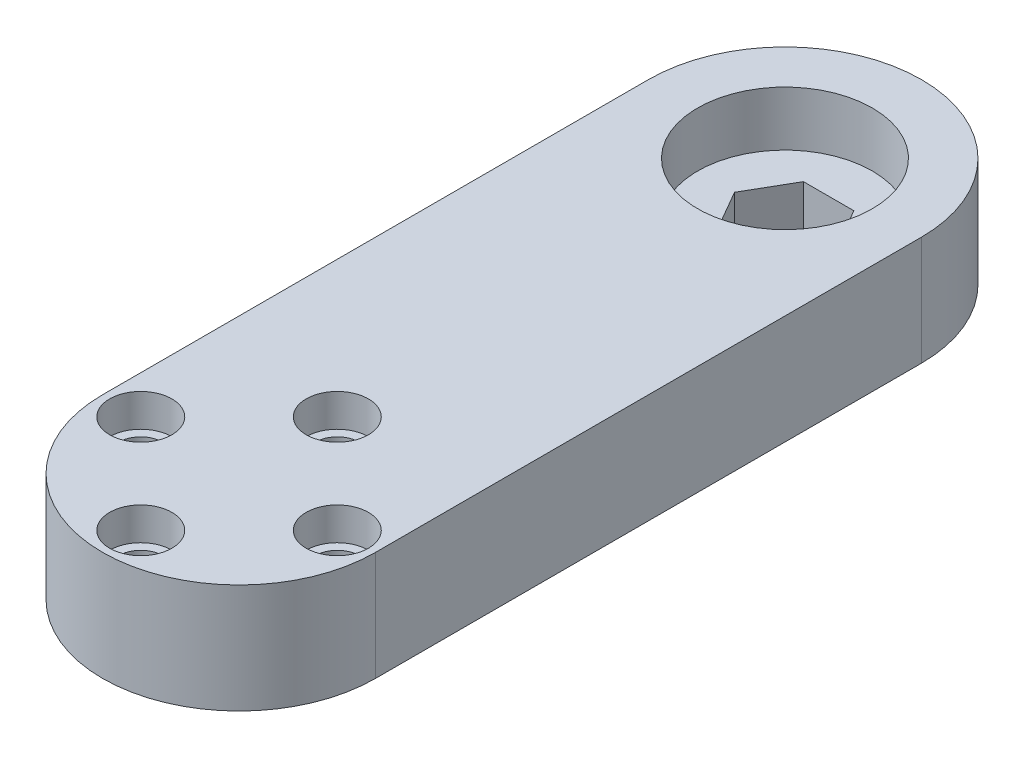
ISO-10303-21;
HEADER;
FILE_DESCRIPTION(('STEP AP214'),'2;1');
FILE_NAME('part.step','',(''),(''),'','','');
FILE_SCHEMA(('AUTOMOTIVE_DESIGN { 1 0 10303 214 1 1 1 1 }'));
ENDSEC;
DATA;
#1=APPLICATION_CONTEXT('core data for automotive mechanical design processes');
#2=APPLICATION_PROTOCOL_DEFINITION('international standard','automotive_design',2000,#1);
#3=PRODUCT_CONTEXT('',#1,'mechanical');
#4=PRODUCT('Part','Part','',(#3));
#5=PRODUCT_RELATED_PRODUCT_CATEGORY('part','',(#4));
#6=PRODUCT_DEFINITION_FORMATION('','',#4);
#7=PRODUCT_DEFINITION_CONTEXT('part definition',#1,'design');
#8=PRODUCT_DEFINITION('design','',#6,#7);
#9=PRODUCT_DEFINITION_SHAPE('','',#8);
#10=(LENGTH_UNIT() NAMED_UNIT(*) SI_UNIT(.MILLI.,.METRE.));
#11=(NAMED_UNIT(*) PLANE_ANGLE_UNIT() SI_UNIT($,.RADIAN.));
#12=(NAMED_UNIT(*) SI_UNIT($,.STERADIAN.) SOLID_ANGLE_UNIT());
#13=UNCERTAINTY_MEASURE_WITH_UNIT(LENGTH_MEASURE(1.E-05),#10,'distance_accuracy_value','');
#14=(GEOMETRIC_REPRESENTATION_CONTEXT(3) GLOBAL_UNCERTAINTY_ASSIGNED_CONTEXT((#13)) GLOBAL_UNIT_ASSIGNED_CONTEXT((#10,
#11,#12)) REPRESENTATION_CONTEXT('',''));
#15=CARTESIAN_POINT('',(0.,0.,0.));
#16=DIRECTION('',(0.,0.,1.));
#17=DIRECTION('',(1.,0.,0.));
#18=AXIS2_PLACEMENT_3D('',#15,#16,#17);
#19=CARTESIAN_POINT('',(0.,10.,0.));
#20=DIRECTION('',(0.,-1.,0.));
#21=DIRECTION('',(0.,0.,-1.));
#22=AXIS2_PLACEMENT_3D('',#19,#20,#21);
#23=CYLINDRICAL_SURFACE('',#22,12.5);
#24=CARTESIAN_POINT('',(0.,0.,0.));
#25=DIRECTION('',(0.,1.,0.));
#26=DIRECTION('',(0.,0.,1.));
#27=AXIS2_PLACEMENT_3D('',#24,#25,#26);
#28=CIRCLE('',#27,12.5);
#29=CARTESIAN_POINT('',(-12.5,0.,0.));
#30=VERTEX_POINT('',#29);
#31=CARTESIAN_POINT('',(12.5,0.,0.));
#32=VERTEX_POINT('',#31);
#33=EDGE_CURVE('E171',#30,#32,#28,.T.);
#34=ORIENTED_EDGE('',*,*,#33,.T.);
#35=DIRECTION('',(0.,-1.,0.));
#36=VECTOR('',#35,1.);
#37=CARTESIAN_POINT('',(12.5,10.,0.));
#38=LINE('',#37,#36);
#39=CARTESIAN_POINT('',(12.5,10.,0.));
#40=VERTEX_POINT('',#39);
#41=EDGE_CURVE('E220',#40,#32,#38,.T.);
#42=ORIENTED_EDGE('',*,*,#41,.F.);
#43=CARTESIAN_POINT('',(0.,10.,0.));
#44=DIRECTION('',(0.,1.,0.));
#45=DIRECTION('',(0.,0.,1.));
#46=AXIS2_PLACEMENT_3D('',#43,#44,#45);
#47=CIRCLE('',#46,12.5);
#48=CARTESIAN_POINT('',(-12.5,10.,0.));
#49=VERTEX_POINT('',#48);
#50=EDGE_CURVE('E194',#49,#40,#47,.T.);
#51=ORIENTED_EDGE('',*,*,#50,.F.);
#52=DIRECTION('',(0.,-1.,0.));
#53=VECTOR('',#52,1.);
#54=CARTESIAN_POINT('',(-12.5,10.,0.));
#55=LINE('',#54,#53);
#56=EDGE_CURVE('E204',#49,#30,#55,.T.);
#57=ORIENTED_EDGE('',*,*,#56,.T.);
#58=EDGE_LOOP('',(#34,#42,#51,#57));
#59=FACE_BOUND('',#58,.T.);
#60=ADVANCED_FACE('F34',(#59),#23,.T.);
#61=CARTESIAN_POINT('',(12.5,10.,0.));
#62=DIRECTION('',(-1.,0.,0.));
#63=DIRECTION('',(0.,0.,1.));
#64=AXIS2_PLACEMENT_3D('',#61,#62,#63);
#65=PLANE('',#64);
#66=DIRECTION('',(0.,0.,-1.));
#67=VECTOR('',#66,1.);
#68=CARTESIAN_POINT('',(12.5,0.,0.));
#69=LINE('',#68,#67);
#70=CARTESIAN_POINT('',(12.5,0.,-50.));
#71=VERTEX_POINT('',#70);
#72=EDGE_CURVE('E207',#32,#71,#69,.T.);
#73=ORIENTED_EDGE('',*,*,#72,.T.);
#74=DIRECTION('',(0.,-1.,0.));
#75=VECTOR('',#74,1.);
#76=CARTESIAN_POINT('',(12.5,10.,-50.));
#77=LINE('',#76,#75);
#78=CARTESIAN_POINT('',(12.5,10.,-50.));
#79=VERTEX_POINT('',#78);
#80=EDGE_CURVE('E217',#79,#71,#77,.T.);
#81=ORIENTED_EDGE('',*,*,#80,.F.);
#82=DIRECTION('',(0.,0.,-1.));
#83=VECTOR('',#82,1.);
#84=CARTESIAN_POINT('',(12.5,10.,0.));
#85=LINE('',#84,#83);
#86=EDGE_CURVE('E197',#40,#79,#85,.T.);
#87=ORIENTED_EDGE('',*,*,#86,.F.);
#88=ORIENTED_EDGE('',*,*,#41,.T.);
#89=EDGE_LOOP('',(#73,#81,#87,#88));
#90=FACE_BOUND('',#89,.T.);
#91=ADVANCED_FACE('F267',(#90),#65,.F.);
#92=CARTESIAN_POINT('',(0.,10.,-50.));
#93=DIRECTION('',(0.,-1.,0.));
#94=DIRECTION('',(0.,0.,-1.));
#95=AXIS2_PLACEMENT_3D('',#92,#93,#94);
#96=CYLINDRICAL_SURFACE('',#95,12.5);
#97=CARTESIAN_POINT('',(0.,0.,-50.));
#98=DIRECTION('',(0.,1.,0.));
#99=DIRECTION('',(0.,0.,1.));
#100=AXIS2_PLACEMENT_3D('',#97,#98,#99);
#101=CIRCLE('',#100,12.5);
#102=CARTESIAN_POINT('',(-12.5,0.,-50.));
#103=VERTEX_POINT('',#102);
#104=EDGE_CURVE('E209',#71,#103,#101,.T.);
#105=ORIENTED_EDGE('',*,*,#104,.T.);
#106=DIRECTION('',(0.,-1.,0.));
#107=VECTOR('',#106,1.);
#108=CARTESIAN_POINT('',(-12.5,10.,-50.));
#109=LINE('',#108,#107);
#110=CARTESIAN_POINT('',(-12.5,10.,-50.));
#111=VERTEX_POINT('',#110);
#112=EDGE_CURVE('E214',#111,#103,#109,.T.);
#113=ORIENTED_EDGE('',*,*,#112,.F.);
#114=CARTESIAN_POINT('',(0.,10.,-50.));
#115=DIRECTION('',(0.,1.,0.));
#116=DIRECTION('',(0.,0.,1.));
#117=AXIS2_PLACEMENT_3D('',#114,#115,#116);
#118=CIRCLE('',#117,12.5);
#119=EDGE_CURVE('E200',#79,#111,#118,.T.);
#120=ORIENTED_EDGE('',*,*,#119,.F.);
#121=ORIENTED_EDGE('',*,*,#80,.T.);
#122=EDGE_LOOP('',(#105,#113,#120,#121));
#123=FACE_BOUND('',#122,.T.);
#124=ADVANCED_FACE('F272',(#123),#96,.T.);
#125=CARTESIAN_POINT('',(-12.5,10.,0.));
#126=DIRECTION('',(1.,0.,0.));
#127=DIRECTION('',(0.,0.,-1.));
#128=AXIS2_PLACEMENT_3D('',#125,#126,#127);
#129=PLANE('',#128);
#130=DIRECTION('',(0.,0.,1.));
#131=VECTOR('',#130,1.);
#132=CARTESIAN_POINT('',(-12.5,0.,0.));
#133=LINE('',#132,#131);
#134=EDGE_CURVE('E198',#103,#30,#133,.T.);
#135=ORIENTED_EDGE('',*,*,#134,.T.);
#136=ORIENTED_EDGE('',*,*,#56,.F.);
#137=DIRECTION('',(0.,0.,1.));
#138=VECTOR('',#137,1.);
#139=CARTESIAN_POINT('',(-12.5,10.,0.));
#140=LINE('',#139,#138);
#141=EDGE_CURVE('E202',#111,#49,#140,.T.);
#142=ORIENTED_EDGE('',*,*,#141,.F.);
#143=ORIENTED_EDGE('',*,*,#112,.T.);
#144=EDGE_LOOP('',(#135,#136,#142,#143));
#145=FACE_BOUND('',#144,.T.);
#146=ADVANCED_FACE('F288',(#145),#129,.F.);
#147=CARTESIAN_POINT('',(0.,10.,0.));
#148=DIRECTION('',(0.,1.,0.));
#149=DIRECTION('',(0.,0.,1.));
#150=AXIS2_PLACEMENT_3D('',#147,#148,#149);
#151=PLANE('',#150);
#152=CARTESIAN_POINT('',(0.,10.,-50.));
#153=DIRECTION('',(0.,-1.,0.));
#154=DIRECTION('',(0.,0.,-1.));
#155=AXIS2_PLACEMENT_3D('',#152,#153,#154);
#156=CIRCLE('',#155,8.);
#157=CARTESIAN_POINT('',(0.,10.,-58.));
#158=VERTEX_POINT('',#157);
#159=EDGE_CURVE('E143',#158,#158,#156,.T.);
#160=ORIENTED_EDGE('',*,*,#159,.T.);
#161=EDGE_LOOP('',(#160));
#162=FACE_BOUND('',#161,.T.);
#163=CARTESIAN_POINT('',(0.,10.,-9.));
#164=DIRECTION('',(0.,1.,0.));
#165=DIRECTION('',(0.,0.,1.));
#166=AXIS2_PLACEMENT_3D('',#163,#164,#165);
#167=CIRCLE('',#166,2.85);
#168=CARTESIAN_POINT('',(0.,10.,-6.15));
#169=VERTEX_POINT('',#168);
#170=EDGE_CURVE('E172',#169,#169,#167,.T.);
#171=ORIENTED_EDGE('',*,*,#170,.F.);
#172=EDGE_LOOP('',(#171));
#173=FACE_BOUND('',#172,.T.);
#174=CARTESIAN_POINT('',(9.,10.,0.));
#175=DIRECTION('',(0.,1.,0.));
#176=DIRECTION('',(0.,0.,1.));
#177=AXIS2_PLACEMENT_3D('',#174,#175,#176);
#178=CIRCLE('',#177,2.85);
#179=CARTESIAN_POINT('',(9.,10.,2.85));
#180=VERTEX_POINT('',#179);
#181=EDGE_CURVE('E178',#180,#180,#178,.T.);
#182=ORIENTED_EDGE('',*,*,#181,.F.);
#183=EDGE_LOOP('',(#182));
#184=FACE_BOUND('',#183,.T.);
#185=CARTESIAN_POINT('',(0.,10.,9.));
#186=DIRECTION('',(0.,1.,0.));
#187=DIRECTION('',(0.,0.,1.));
#188=AXIS2_PLACEMENT_3D('',#185,#186,#187);
#189=CIRCLE('',#188,2.85);
#190=CARTESIAN_POINT('',(0.,10.,11.85));
#191=VERTEX_POINT('',#190);
#192=EDGE_CURVE('E184',#191,#191,#189,.T.);
#193=ORIENTED_EDGE('',*,*,#192,.F.);
#194=EDGE_LOOP('',(#193));
#195=FACE_BOUND('',#194,.T.);
#196=CARTESIAN_POINT('',(-9.,10.,0.));
#197=DIRECTION('',(0.,1.,0.));
#198=DIRECTION('',(0.,0.,1.));
#199=AXIS2_PLACEMENT_3D('',#196,#197,#198);
#200=CIRCLE('',#199,2.85);
#201=CARTESIAN_POINT('',(-9.,10.,2.85));
#202=VERTEX_POINT('',#201);
#203=EDGE_CURVE('E190',#202,#202,#200,.T.);
#204=ORIENTED_EDGE('',*,*,#203,.F.);
#205=EDGE_LOOP('',(#204));
#206=FACE_BOUND('',#205,.T.);
#207=ORIENTED_EDGE('',*,*,#50,.T.);
#208=ORIENTED_EDGE('',*,*,#86,.T.);
#209=ORIENTED_EDGE('',*,*,#119,.T.);
#210=ORIENTED_EDGE('',*,*,#141,.T.);
#211=EDGE_LOOP('',(#207,#208,#209,#210));
#212=FACE_BOUND('',#211,.T.);
#213=ADVANCED_FACE('F284',(#162,#173,#184,#195,#206,#212),#151,.T.);
#214=CARTESIAN_POINT('',(0.,0.,0.));
#215=DIRECTION('',(0.,1.,0.));
#216=DIRECTION('',(0.,0.,1.));
#217=AXIS2_PLACEMENT_3D('',#214,#215,#216);
#218=PLANE('',#217);
#219=DIRECTION('',(-0.5,0.,0.866025403784438));
#220=VECTOR('',#219,1.);
#221=CARTESIAN_POINT('',(4.61880215351699,0.,-50.));
#222=LINE('',#221,#220);
#223=CARTESIAN_POINT('',(4.618802153517,0.,-50.));
#224=VERTEX_POINT('',#223);
#225=CARTESIAN_POINT('',(2.3094010767585,0.,-46.));
#226=VERTEX_POINT('',#225);
#227=EDGE_CURVE('E122',#224,#226,#222,.T.);
#228=ORIENTED_EDGE('',*,*,#227,.F.);
#229=DIRECTION('',(0.5,0.,0.866025403784439));
#230=VECTOR('',#229,1.);
#231=CARTESIAN_POINT('',(2.30940107675849,0.,-54.));
#232=LINE('',#231,#230);
#233=CARTESIAN_POINT('',(2.30940107675849,0.,-54.));
#234=VERTEX_POINT('',#233);
#235=EDGE_CURVE('E48',#234,#224,#232,.T.);
#236=ORIENTED_EDGE('',*,*,#235,.F.);
#237=DIRECTION('',(1.,0.,0.));
#238=VECTOR('',#237,1.);
#239=CARTESIAN_POINT('',(-2.3094010767585,0.,-54.));
#240=LINE('',#239,#238);
#241=CARTESIAN_POINT('',(-2.3094010767585,0.,-54.));
#242=VERTEX_POINT('',#241);
#243=EDGE_CURVE('E138',#242,#234,#240,.T.);
#244=ORIENTED_EDGE('',*,*,#243,.F.);
#245=DIRECTION('',(0.5,0.,-0.866025403784439));
#246=VECTOR('',#245,1.);
#247=CARTESIAN_POINT('',(-4.618802153517,0.,-50.));
#248=LINE('',#247,#246);
#249=CARTESIAN_POINT('',(-4.618802153517,0.,-50.));
#250=VERTEX_POINT('',#249);
#251=EDGE_CURVE('E132',#250,#242,#248,.T.);
#252=ORIENTED_EDGE('',*,*,#251,.F.);
#253=DIRECTION('',(-0.500000000000001,0.,-0.866025403784438));
#254=VECTOR('',#253,1.);
#255=CARTESIAN_POINT('',(-2.3094010767585,0.,-46.));
#256=LINE('',#255,#254);
#257=CARTESIAN_POINT('',(-2.3094010767585,0.,-46.));
#258=VERTEX_POINT('',#257);
#259=EDGE_CURVE('E130',#258,#250,#256,.T.);
#260=ORIENTED_EDGE('',*,*,#259,.F.);
#261=DIRECTION('',(-1.,0.,0.));
#262=VECTOR('',#261,1.);
#263=CARTESIAN_POINT('',(2.3094010767585,0.,-46.));
#264=LINE('',#263,#262);
#265=EDGE_CURVE('E113',#226,#258,#264,.T.);
#266=ORIENTED_EDGE('',*,*,#265,.F.);
#267=EDGE_LOOP('',(#228,#236,#244,#252,#260,#266));
#268=FACE_BOUND('',#267,.T.);
#269=CARTESIAN_POINT('',(0.,0.,-9.));
#270=DIRECTION('',(0.,1.,0.));
#271=DIRECTION('',(0.,0.,1.));
#272=AXIS2_PLACEMENT_3D('',#269,#270,#271);
#273=CIRCLE('',#272,2.);
#274=CARTESIAN_POINT('',(0.,0.,-7.));
#275=VERTEX_POINT('',#274);
#276=EDGE_CURVE('E156',#275,#275,#273,.T.);
#277=ORIENTED_EDGE('',*,*,#276,.T.);
#278=EDGE_LOOP('',(#277));
#279=FACE_BOUND('',#278,.T.);
#280=CARTESIAN_POINT('',(9.,0.,0.));
#281=DIRECTION('',(0.,1.,0.));
#282=DIRECTION('',(0.,0.,1.));
#283=AXIS2_PLACEMENT_3D('',#280,#281,#282);
#284=CIRCLE('',#283,2.);
#285=CARTESIAN_POINT('',(9.,0.,2.));
#286=VERTEX_POINT('',#285);
#287=EDGE_CURVE('E160',#286,#286,#284,.T.);
#288=ORIENTED_EDGE('',*,*,#287,.T.);
#289=EDGE_LOOP('',(#288));
#290=FACE_BOUND('',#289,.T.);
#291=CARTESIAN_POINT('',(0.,0.,9.));
#292=DIRECTION('',(0.,1.,0.));
#293=DIRECTION('',(0.,0.,1.));
#294=AXIS2_PLACEMENT_3D('',#291,#292,#293);
#295=CIRCLE('',#294,2.);
#296=CARTESIAN_POINT('',(0.,0.,11.));
#297=VERTEX_POINT('',#296);
#298=EDGE_CURVE('E163',#297,#297,#295,.T.);
#299=ORIENTED_EDGE('',*,*,#298,.T.);
#300=EDGE_LOOP('',(#299));
#301=FACE_BOUND('',#300,.T.);
#302=CARTESIAN_POINT('',(-9.,0.,0.));
#303=DIRECTION('',(0.,1.,0.));
#304=DIRECTION('',(0.,0.,1.));
#305=AXIS2_PLACEMENT_3D('',#302,#303,#304);
#306=CIRCLE('',#305,2.);
#307=CARTESIAN_POINT('',(-9.,0.,2.));
#308=VERTEX_POINT('',#307);
#309=EDGE_CURVE('E153',#308,#308,#306,.T.);
#310=ORIENTED_EDGE('',*,*,#309,.T.);
#311=EDGE_LOOP('',(#310));
#312=FACE_BOUND('',#311,.T.);
#313=ORIENTED_EDGE('',*,*,#33,.F.);
#314=ORIENTED_EDGE('',*,*,#134,.F.);
#315=ORIENTED_EDGE('',*,*,#104,.F.);
#316=ORIENTED_EDGE('',*,*,#72,.F.);
#317=EDGE_LOOP('',(#313,#314,#315,#316));
#318=FACE_BOUND('',#317,.T.);
#319=ADVANCED_FACE('F126',(#268,#279,#290,#301,#312,#318),#218,.F.);
#320=CARTESIAN_POINT('',(-9.,7.,0.));
#321=DIRECTION('',(0.,1.,0.));
#322=DIRECTION('',(0.,0.,1.));
#323=AXIS2_PLACEMENT_3D('',#320,#321,#322);
#324=CYLINDRICAL_SURFACE('',#323,2.85);
#325=CARTESIAN_POINT('',(-9.,7.,0.));
#326=DIRECTION('',(0.,1.,0.));
#327=DIRECTION('',(0.,0.,1.));
#328=AXIS2_PLACEMENT_3D('',#325,#326,#327);
#329=CIRCLE('',#328,2.85);
#330=CARTESIAN_POINT('',(-9.,7.,2.85));
#331=VERTEX_POINT('',#330);
#332=EDGE_CURVE('E187',#331,#331,#329,.T.);
#333=ORIENTED_EDGE('',*,*,#332,.F.);
#334=EDGE_LOOP('',(#333));
#335=FACE_BOUND('',#334,.T.);
#336=ORIENTED_EDGE('',*,*,#203,.T.);
#337=EDGE_LOOP('',(#336));
#338=FACE_BOUND('',#337,.T.);
#339=ADVANCED_FACE('F299',(#335,#338),#324,.F.);
#340=CARTESIAN_POINT('',(-9.,7.,0.));
#341=DIRECTION('',(0.,1.,0.));
#342=DIRECTION('',(0.,0.,1.));
#343=AXIS2_PLACEMENT_3D('',#340,#341,#342);
#344=PLANE('',#343);
#345=CARTESIAN_POINT('',(-9.,7.,0.));
#346=DIRECTION('',(0.,1.,0.));
#347=DIRECTION('',(0.,0.,1.));
#348=AXIS2_PLACEMENT_3D('',#345,#346,#347);
#349=CIRCLE('',#348,2.);
#350=CARTESIAN_POINT('',(-9.,7.,2.));
#351=VERTEX_POINT('',#350);
#352=EDGE_CURVE('E193',#351,#351,#349,.T.);
#353=ORIENTED_EDGE('',*,*,#352,.F.);
#354=EDGE_LOOP('',(#353));
#355=FACE_BOUND('',#354,.T.);
#356=ORIENTED_EDGE('',*,*,#332,.T.);
#357=EDGE_LOOP('',(#356));
#358=FACE_BOUND('',#357,.T.);
#359=ADVANCED_FACE('F305',(#355,#358),#344,.T.);
#360=CARTESIAN_POINT('',(0.,7.,9.));
#361=DIRECTION('',(0.,1.,0.));
#362=DIRECTION('',(0.,0.,1.));
#363=AXIS2_PLACEMENT_3D('',#360,#361,#362);
#364=CYLINDRICAL_SURFACE('',#363,2.85);
#365=CARTESIAN_POINT('',(0.,7.,9.));
#366=DIRECTION('',(0.,1.,0.));
#367=DIRECTION('',(0.,0.,1.));
#368=AXIS2_PLACEMENT_3D('',#365,#366,#367);
#369=CIRCLE('',#368,2.85);
#370=CARTESIAN_POINT('',(0.,7.,11.85));
#371=VERTEX_POINT('',#370);
#372=EDGE_CURVE('E181',#371,#371,#369,.T.);
#373=ORIENTED_EDGE('',*,*,#372,.F.);
#374=EDGE_LOOP('',(#373));
#375=FACE_BOUND('',#374,.T.);
#376=ORIENTED_EDGE('',*,*,#192,.T.);
#377=EDGE_LOOP('',(#376));
#378=FACE_BOUND('',#377,.T.);
#379=ADVANCED_FACE('F309',(#375,#378),#364,.F.);
#380=CARTESIAN_POINT('',(0.,7.,9.));
#381=DIRECTION('',(0.,1.,0.));
#382=DIRECTION('',(0.,0.,1.));
#383=AXIS2_PLACEMENT_3D('',#380,#381,#382);
#384=PLANE('',#383);
#385=CARTESIAN_POINT('',(0.,7.,9.));
#386=DIRECTION('',(0.,1.,0.));
#387=DIRECTION('',(0.,0.,1.));
#388=AXIS2_PLACEMENT_3D('',#385,#386,#387);
#389=CIRCLE('',#388,2.);
#390=CARTESIAN_POINT('',(0.,7.,11.));
#391=VERTEX_POINT('',#390);
#392=EDGE_CURVE('E229',#391,#391,#389,.T.);
#393=ORIENTED_EDGE('',*,*,#392,.F.);
#394=EDGE_LOOP('',(#393));
#395=FACE_BOUND('',#394,.T.);
#396=ORIENTED_EDGE('',*,*,#372,.T.);
#397=EDGE_LOOP('',(#396));
#398=FACE_BOUND('',#397,.T.);
#399=ADVANCED_FACE('F313',(#395,#398),#384,.T.);
#400=CARTESIAN_POINT('',(9.,7.,0.));
#401=DIRECTION('',(0.,1.,0.));
#402=DIRECTION('',(0.,0.,1.));
#403=AXIS2_PLACEMENT_3D('',#400,#401,#402);
#404=CYLINDRICAL_SURFACE('',#403,2.85);
#405=CARTESIAN_POINT('',(9.,7.,0.));
#406=DIRECTION('',(0.,1.,0.));
#407=DIRECTION('',(0.,0.,1.));
#408=AXIS2_PLACEMENT_3D('',#405,#406,#407);
#409=CIRCLE('',#408,2.85);
#410=CARTESIAN_POINT('',(9.,7.,2.85));
#411=VERTEX_POINT('',#410);
#412=EDGE_CURVE('E175',#411,#411,#409,.T.);
#413=ORIENTED_EDGE('',*,*,#412,.F.);
#414=EDGE_LOOP('',(#413));
#415=FACE_BOUND('',#414,.T.);
#416=ORIENTED_EDGE('',*,*,#181,.T.);
#417=EDGE_LOOP('',(#416));
#418=FACE_BOUND('',#417,.T.);
#419=ADVANCED_FACE('F317',(#415,#418),#404,.F.);
#420=CARTESIAN_POINT('',(9.,7.,0.));
#421=DIRECTION('',(0.,1.,0.));
#422=DIRECTION('',(0.,0.,1.));
#423=AXIS2_PLACEMENT_3D('',#420,#421,#422);
#424=PLANE('',#423);
#425=CARTESIAN_POINT('',(9.,7.,0.));
#426=DIRECTION('',(0.,1.,0.));
#427=DIRECTION('',(0.,0.,1.));
#428=AXIS2_PLACEMENT_3D('',#425,#426,#427);
#429=CIRCLE('',#428,2.);
#430=CARTESIAN_POINT('',(9.,7.,2.));
#431=VERTEX_POINT('',#430);
#432=EDGE_CURVE('E226',#431,#431,#429,.T.);
#433=ORIENTED_EDGE('',*,*,#432,.F.);
#434=EDGE_LOOP('',(#433));
#435=FACE_BOUND('',#434,.T.);
#436=ORIENTED_EDGE('',*,*,#412,.T.);
#437=EDGE_LOOP('',(#436));
#438=FACE_BOUND('',#437,.T.);
#439=ADVANCED_FACE('F321',(#435,#438),#424,.T.);
#440=CARTESIAN_POINT('',(0.,7.,-9.));
#441=DIRECTION('',(0.,1.,0.));
#442=DIRECTION('',(0.,0.,1.));
#443=AXIS2_PLACEMENT_3D('',#440,#441,#442);
#444=CYLINDRICAL_SURFACE('',#443,2.85);
#445=CARTESIAN_POINT('',(0.,7.,-9.));
#446=DIRECTION('',(0.,1.,0.));
#447=DIRECTION('',(0.,0.,1.));
#448=AXIS2_PLACEMENT_3D('',#445,#446,#447);
#449=CIRCLE('',#448,2.85);
#450=CARTESIAN_POINT('',(0.,7.,-6.15));
#451=VERTEX_POINT('',#450);
#452=EDGE_CURVE('E168',#451,#451,#449,.T.);
#453=ORIENTED_EDGE('',*,*,#452,.F.);
#454=EDGE_LOOP('',(#453));
#455=FACE_BOUND('',#454,.T.);
#456=ORIENTED_EDGE('',*,*,#170,.T.);
#457=EDGE_LOOP('',(#456));
#458=FACE_BOUND('',#457,.T.);
#459=ADVANCED_FACE('F325',(#455,#458),#444,.F.);
#460=CARTESIAN_POINT('',(0.,7.,-9.));
#461=DIRECTION('',(0.,1.,0.));
#462=DIRECTION('',(0.,0.,1.));
#463=AXIS2_PLACEMENT_3D('',#460,#461,#462);
#464=PLANE('',#463);
#465=CARTESIAN_POINT('',(0.,7.,-9.));
#466=DIRECTION('',(0.,1.,0.));
#467=DIRECTION('',(0.,0.,1.));
#468=AXIS2_PLACEMENT_3D('',#465,#466,#467);
#469=CIRCLE('',#468,2.);
#470=CARTESIAN_POINT('',(0.,7.,-7.));
#471=VERTEX_POINT('',#470);
#472=EDGE_CURVE('E159',#471,#471,#469,.T.);
#473=ORIENTED_EDGE('',*,*,#472,.F.);
#474=EDGE_LOOP('',(#473));
#475=FACE_BOUND('',#474,.T.);
#476=ORIENTED_EDGE('',*,*,#452,.T.);
#477=EDGE_LOOP('',(#476));
#478=FACE_BOUND('',#477,.T.);
#479=ADVANCED_FACE('F329',(#475,#478),#464,.T.);
#480=CARTESIAN_POINT('',(0.,0.,-9.));
#481=DIRECTION('',(0.,1.,0.));
#482=DIRECTION('',(0.,0.,1.));
#483=AXIS2_PLACEMENT_3D('',#480,#481,#482);
#484=CYLINDRICAL_SURFACE('',#483,2.);
#485=ORIENTED_EDGE('',*,*,#472,.T.);
#486=EDGE_LOOP('',(#485));
#487=FACE_BOUND('',#486,.T.);
#488=ORIENTED_EDGE('',*,*,#276,.F.);
#489=EDGE_LOOP('',(#488));
#490=FACE_BOUND('',#489,.T.);
#491=ADVANCED_FACE('F333',(#487,#490),#484,.F.);
#492=CARTESIAN_POINT('',(9.,0.,0.));
#493=DIRECTION('',(0.,1.,0.));
#494=DIRECTION('',(0.,0.,1.));
#495=AXIS2_PLACEMENT_3D('',#492,#493,#494);
#496=CYLINDRICAL_SURFACE('',#495,2.);
#497=ORIENTED_EDGE('',*,*,#432,.T.);
#498=EDGE_LOOP('',(#497));
#499=FACE_BOUND('',#498,.T.);
#500=ORIENTED_EDGE('',*,*,#287,.F.);
#501=EDGE_LOOP('',(#500));
#502=FACE_BOUND('',#501,.T.);
#503=ADVANCED_FACE('F342',(#499,#502),#496,.F.);
#504=CARTESIAN_POINT('',(0.,0.,9.));
#505=DIRECTION('',(0.,1.,0.));
#506=DIRECTION('',(0.,0.,1.));
#507=AXIS2_PLACEMENT_3D('',#504,#505,#506);
#508=CYLINDRICAL_SURFACE('',#507,2.);
#509=ORIENTED_EDGE('',*,*,#392,.T.);
#510=EDGE_LOOP('',(#509));
#511=FACE_BOUND('',#510,.T.);
#512=ORIENTED_EDGE('',*,*,#298,.F.);
#513=EDGE_LOOP('',(#512));
#514=FACE_BOUND('',#513,.T.);
#515=ADVANCED_FACE('F338',(#511,#514),#508,.F.);
#516=CARTESIAN_POINT('',(-9.,0.,0.));
#517=DIRECTION('',(0.,1.,0.));
#518=DIRECTION('',(0.,0.,1.));
#519=AXIS2_PLACEMENT_3D('',#516,#517,#518);
#520=CYLINDRICAL_SURFACE('',#519,2.);
#521=ORIENTED_EDGE('',*,*,#352,.T.);
#522=EDGE_LOOP('',(#521));
#523=FACE_BOUND('',#522,.T.);
#524=ORIENTED_EDGE('',*,*,#309,.F.);
#525=EDGE_LOOP('',(#524));
#526=FACE_BOUND('',#525,.T.);
#527=ADVANCED_FACE('F335',(#523,#526),#520,.F.);
#528=CARTESIAN_POINT('',(0.,5.,-50.));
#529=DIRECTION('',(0.,1.,0.));
#530=DIRECTION('',(0.,0.,1.));
#531=AXIS2_PLACEMENT_3D('',#528,#529,#530);
#532=CYLINDRICAL_SURFACE('',#531,8.);
#533=CARTESIAN_POINT('',(0.,5.,-50.));
#534=DIRECTION('',(0.,-1.,0.));
#535=DIRECTION('',(0.,0.,-1.));
#536=AXIS2_PLACEMENT_3D('',#533,#534,#535);
#537=CIRCLE('',#536,8.);
#538=CARTESIAN_POINT('',(0.,5.,-58.));
#539=VERTEX_POINT('',#538);
#540=EDGE_CURVE('E150',#539,#539,#537,.T.);
#541=ORIENTED_EDGE('',*,*,#540,.T.);
#542=EDGE_LOOP('',(#541));
#543=FACE_BOUND('',#542,.T.);
#544=ORIENTED_EDGE('',*,*,#159,.F.);
#545=EDGE_LOOP('',(#544));
#546=FACE_BOUND('',#545,.T.);
#547=ADVANCED_FACE('F263',(#543,#546),#532,.F.);
#548=CARTESIAN_POINT('',(0.,5.,-50.));
#549=DIRECTION('',(0.,-1.,0.));
#550=DIRECTION('',(0.,0.,-1.));
#551=AXIS2_PLACEMENT_3D('',#548,#549,#550);
#552=PLANE('',#551);
#553=DIRECTION('',(1.,0.,0.));
#554=VECTOR('',#553,1.);
#555=CARTESIAN_POINT('',(0.,5.,-54.));
#556=LINE('',#555,#554);
#557=CARTESIAN_POINT('',(-2.3094010767585,5.,-54.));
#558=VERTEX_POINT('',#557);
#559=CARTESIAN_POINT('',(2.30940107675849,5.,-54.));
#560=VERTEX_POINT('',#559);
#561=EDGE_CURVE('E41',#558,#560,#556,.T.);
#562=ORIENTED_EDGE('',*,*,#561,.T.);
#563=DIRECTION('',(0.5,0.,0.866025403784439));
#564=VECTOR('',#563,1.);
#565=CARTESIAN_POINT('',(3.46410161513774,5.,-52.));
#566=LINE('',#565,#564);
#567=CARTESIAN_POINT('',(4.61880215351699,5.,-50.));
#568=VERTEX_POINT('',#567);
#569=EDGE_CURVE('E11',#560,#568,#566,.T.);
#570=ORIENTED_EDGE('',*,*,#569,.T.);
#571=DIRECTION('',(-0.5,0.,0.866025403784438));
#572=VECTOR('',#571,1.);
#573=CARTESIAN_POINT('',(3.46410161513775,5.,-48.));
#574=LINE('',#573,#572);
#575=CARTESIAN_POINT('',(2.3094010767585,5.,-46.));
#576=VERTEX_POINT('',#575);
#577=EDGE_CURVE('E223',#568,#576,#574,.T.);
#578=ORIENTED_EDGE('',*,*,#577,.T.);
#579=DIRECTION('',(-1.,0.,0.));
#580=VECTOR('',#579,1.);
#581=CARTESIAN_POINT('',(0.,5.,-46.));
#582=LINE('',#581,#580);
#583=CARTESIAN_POINT('',(-2.3094010767585,5.,-46.));
#584=VERTEX_POINT('',#583);
#585=EDGE_CURVE('E116',#576,#584,#582,.T.);
#586=ORIENTED_EDGE('',*,*,#585,.T.);
#587=DIRECTION('',(-0.500000000000001,0.,-0.866025403784438));
#588=VECTOR('',#587,1.);
#589=CARTESIAN_POINT('',(-3.46410161513775,5.,-48.));
#590=LINE('',#589,#588);
#591=CARTESIAN_POINT('',(-4.618802153517,5.,-50.));
#592=VERTEX_POINT('',#591);
#593=EDGE_CURVE('E236',#584,#592,#590,.T.);
#594=ORIENTED_EDGE('',*,*,#593,.T.);
#595=DIRECTION('',(0.5,0.,-0.866025403784439));
#596=VECTOR('',#595,1.);
#597=CARTESIAN_POINT('',(-3.46410161513775,5.,-52.));
#598=LINE('',#597,#596);
#599=EDGE_CURVE('E239',#592,#558,#598,.T.);
#600=ORIENTED_EDGE('',*,*,#599,.T.);
#601=EDGE_LOOP('',(#562,#570,#578,#586,#594,#600));
#602=FACE_BOUND('',#601,.T.);
#603=ORIENTED_EDGE('',*,*,#540,.F.);
#604=EDGE_LOOP('',(#603));
#605=FACE_BOUND('',#604,.T.);
#606=ADVANCED_FACE('F243',(#602,#605),#552,.F.);
#607=CARTESIAN_POINT('',(2.30940107675849,10.,-54.));
#608=DIRECTION('',(0.866025403784439,0.,-0.5));
#609=DIRECTION('',(-0.5,0.,-0.866025403784439));
#610=AXIS2_PLACEMENT_3D('',#607,#608,#609);
#611=PLANE('',#610);
#612=DIRECTION('',(0.,-1.,0.));
#613=VECTOR('',#612,1.);
#614=CARTESIAN_POINT('',(2.30940107675849,10.,-54.));
#615=LINE('',#614,#613);
#616=EDGE_CURVE('E141',#560,#234,#615,.T.);
#617=ORIENTED_EDGE('',*,*,#616,.T.);
#618=ORIENTED_EDGE('',*,*,#235,.T.);
#619=DIRECTION('',(0.,-1.,0.));
#620=VECTOR('',#619,1.);
#621=CARTESIAN_POINT('',(4.61880215351699,10.,-50.));
#622=LINE('',#621,#620);
#623=EDGE_CURVE('E119',#568,#224,#622,.T.);
#624=ORIENTED_EDGE('',*,*,#623,.F.);
#625=ORIENTED_EDGE('',*,*,#569,.F.);
#626=EDGE_LOOP('',(#617,#618,#624,#625));
#627=FACE_BOUND('',#626,.T.);
#628=ADVANCED_FACE('F255',(#627),#611,.F.);
#629=CARTESIAN_POINT('',(-2.3094010767585,10.,-54.));
#630=DIRECTION('',(0.,0.,-1.));
#631=DIRECTION('',(-1.,0.,0.));
#632=AXIS2_PLACEMENT_3D('',#629,#630,#631);
#633=PLANE('',#632);
#634=DIRECTION('',(0.,-1.,0.));
#635=VECTOR('',#634,1.);
#636=CARTESIAN_POINT('',(-2.3094010767585,10.,-54.));
#637=LINE('',#636,#635);
#638=EDGE_CURVE('E144',#558,#242,#637,.T.);
#639=ORIENTED_EDGE('',*,*,#638,.T.);
#640=ORIENTED_EDGE('',*,*,#243,.T.);
#641=ORIENTED_EDGE('',*,*,#616,.F.);
#642=ORIENTED_EDGE('',*,*,#561,.F.);
#643=EDGE_LOOP('',(#639,#640,#641,#642));
#644=FACE_BOUND('',#643,.T.);
#645=ADVANCED_FACE('F248',(#644),#633,.F.);
#646=CARTESIAN_POINT('',(-4.618802153517,10.,-50.));
#647=DIRECTION('',(-0.866025403784439,0.,-0.5));
#648=DIRECTION('',(-0.5,0.,0.866025403784439));
#649=AXIS2_PLACEMENT_3D('',#646,#647,#648);
#650=PLANE('',#649);
#651=DIRECTION('',(0.,-1.,0.));
#652=VECTOR('',#651,1.);
#653=CARTESIAN_POINT('',(-4.618802153517,10.,-50.));
#654=LINE('',#653,#652);
#655=EDGE_CURVE('E146',#592,#250,#654,.T.);
#656=ORIENTED_EDGE('',*,*,#655,.T.);
#657=ORIENTED_EDGE('',*,*,#251,.T.);
#658=ORIENTED_EDGE('',*,*,#638,.F.);
#659=ORIENTED_EDGE('',*,*,#599,.F.);
#660=EDGE_LOOP('',(#656,#657,#658,#659));
#661=FACE_BOUND('',#660,.T.);
#662=ADVANCED_FACE('F250',(#661),#650,.F.);
#663=CARTESIAN_POINT('',(-2.3094010767585,10.,-46.));
#664=DIRECTION('',(-0.866025403784438,0.,0.500000000000001));
#665=DIRECTION('',(0.500000000000001,0.,0.866025403784438));
#666=AXIS2_PLACEMENT_3D('',#663,#664,#665);
#667=PLANE('',#666);
#668=DIRECTION('',(0.,-1.,0.));
#669=VECTOR('',#668,1.);
#670=CARTESIAN_POINT('',(-2.3094010767585,10.,-46.));
#671=LINE('',#670,#669);
#672=EDGE_CURVE('E118',#584,#258,#671,.T.);
#673=ORIENTED_EDGE('',*,*,#672,.T.);
#674=ORIENTED_EDGE('',*,*,#259,.T.);
#675=ORIENTED_EDGE('',*,*,#655,.F.);
#676=ORIENTED_EDGE('',*,*,#593,.F.);
#677=EDGE_LOOP('',(#673,#674,#675,#676));
#678=FACE_BOUND('',#677,.T.);
#679=ADVANCED_FACE('F254',(#678),#667,.F.);
#680=CARTESIAN_POINT('',(2.3094010767585,10.,-46.));
#681=DIRECTION('',(0.,0.,1.));
#682=DIRECTION('',(1.,0.,0.));
#683=AXIS2_PLACEMENT_3D('',#680,#681,#682);
#684=PLANE('',#683);
#685=DIRECTION('',(0.,-1.,0.));
#686=VECTOR('',#685,1.);
#687=CARTESIAN_POINT('',(2.3094010767585,10.,-46.));
#688=LINE('',#687,#686);
#689=EDGE_CURVE('E56',#576,#226,#688,.T.);
#690=ORIENTED_EDGE('',*,*,#689,.T.);
#691=ORIENTED_EDGE('',*,*,#265,.T.);
#692=ORIENTED_EDGE('',*,*,#672,.F.);
#693=ORIENTED_EDGE('',*,*,#585,.F.);
#694=EDGE_LOOP('',(#690,#691,#692,#693));
#695=FACE_BOUND('',#694,.T.);
#696=ADVANCED_FACE('F110',(#695),#684,.F.);
#697=CARTESIAN_POINT('',(4.61880215351699,10.,-50.));
#698=DIRECTION('',(0.866025403784438,0.,0.5));
#699=DIRECTION('',(0.5,0.,-0.866025403784438));
#700=AXIS2_PLACEMENT_3D('',#697,#698,#699);
#701=PLANE('',#700);
#702=ORIENTED_EDGE('',*,*,#623,.T.);
#703=ORIENTED_EDGE('',*,*,#227,.T.);
#704=ORIENTED_EDGE('',*,*,#689,.F.);
#705=ORIENTED_EDGE('',*,*,#577,.F.);
#706=EDGE_LOOP('',(#702,#703,#704,#705));
#707=FACE_BOUND('',#706,.T.);
#708=ADVANCED_FACE('F123',(#707),#701,.F.);
#709=CLOSED_SHELL('',(#60,#91,#124,#146,#213,#319,#339,#359,#379,#399,#419,#439,#459,#479,#491,
#503,#515,#527,#547,#606,#628,#645,#662,#679,#696,#708));
#710=MANIFOLD_SOLID_BREP('B2',#709);
#711=ADVANCED_BREP_SHAPE_REPRESENTATION('',(#18,#710),#14);
#712=SHAPE_DEFINITION_REPRESENTATION(#9,#711);
ENDSEC;
END-ISO-10303-21;
